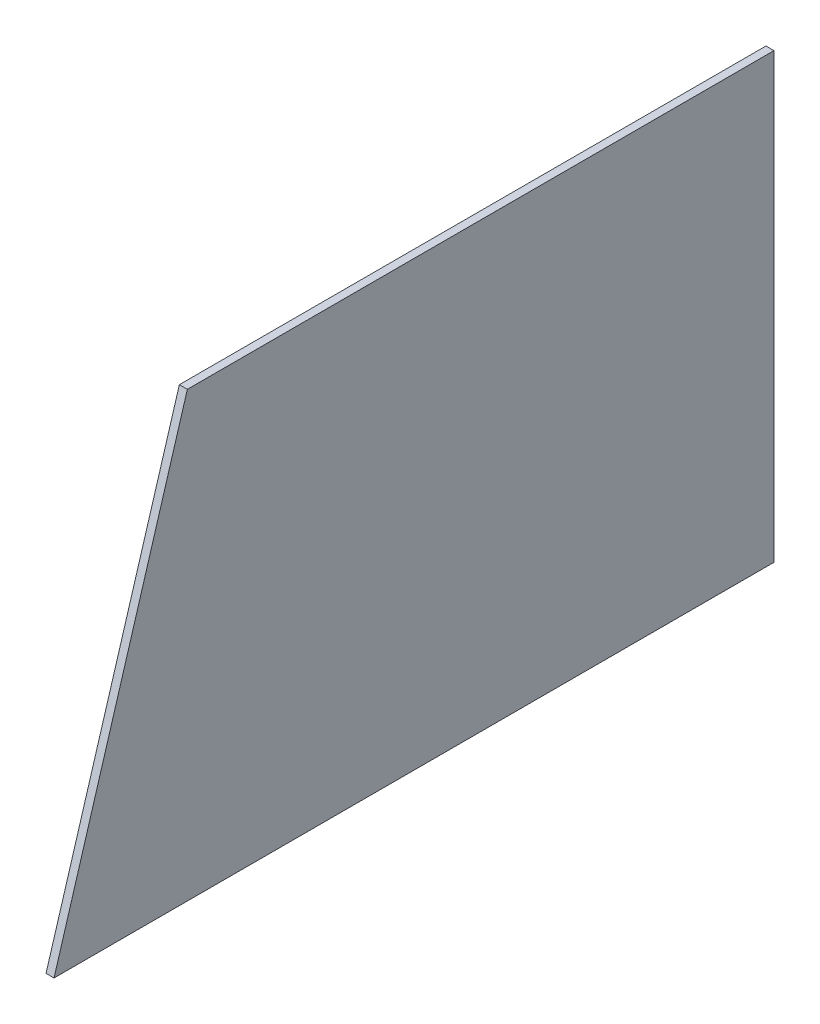
ISO-10303-21;
HEADER;
FILE_DESCRIPTION(('STEP AP214'),'2;1');
FILE_NAME('part.step','',(''),(''),'','','');
FILE_SCHEMA(('AUTOMOTIVE_DESIGN { 1 0 10303 214 1 1 1 1 }'));
ENDSEC;
DATA;
#1=APPLICATION_CONTEXT('core data for automotive mechanical design processes');
#2=APPLICATION_PROTOCOL_DEFINITION('international standard','automotive_design',2000,#1);
#3=PRODUCT_CONTEXT('',#1,'mechanical');
#4=PRODUCT('Part','Part','',(#3));
#5=PRODUCT_RELATED_PRODUCT_CATEGORY('part','',(#4));
#6=PRODUCT_DEFINITION_FORMATION('','',#4);
#7=PRODUCT_DEFINITION_CONTEXT('part definition',#1,'design');
#8=PRODUCT_DEFINITION('design','',#6,#7);
#9=PRODUCT_DEFINITION_SHAPE('','',#8);
#10=(LENGTH_UNIT() NAMED_UNIT(*) SI_UNIT(.MILLI.,.METRE.));
#11=(NAMED_UNIT(*) PLANE_ANGLE_UNIT() SI_UNIT($,.RADIAN.));
#12=(NAMED_UNIT(*) SI_UNIT($,.STERADIAN.) SOLID_ANGLE_UNIT());
#13=UNCERTAINTY_MEASURE_WITH_UNIT(LENGTH_MEASURE(1.E-05),#10,'distance_accuracy_value','');
#14=(GEOMETRIC_REPRESENTATION_CONTEXT(3) GLOBAL_UNCERTAINTY_ASSIGNED_CONTEXT((#13)) GLOBAL_UNIT_ASSIGNED_CONTEXT((#10,
#11,#12)) REPRESENTATION_CONTEXT('',''));
#15=CARTESIAN_POINT('',(0.,0.,0.));
#16=DIRECTION('',(0.,0.,1.));
#17=DIRECTION('',(1.,0.,0.));
#18=AXIS2_PLACEMENT_3D('',#15,#16,#17);
#19=CARTESIAN_POINT('',(3.,-98.7355891387449,270.));
#20=DIRECTION('',(0.,-0.288075600957839,-0.957607669211551));
#21=DIRECTION('',(0.,0.957607669211551,-0.288075600957839));
#22=AXIS2_PLACEMENT_3D('',#19,#20,#21);
#23=PLANE('',#22);
#24=DIRECTION('',(0.,-0.957607669211551,0.288075600957839));
#25=VECTOR('',#24,1.);
#26=CARTESIAN_POINT('',(0.,-98.7355891387449,270.));
#27=LINE('',#26,#25);
#28=CARTESIAN_POINT('',(0.,67.4721122472017,220.));
#29=VERTEX_POINT('',#28);
#30=CARTESIAN_POINT('',(0.,-98.7355891387449,270.));
#31=VERTEX_POINT('',#30);
#32=EDGE_CURVE('E96',#29,#31,#27,.T.);
#33=ORIENTED_EDGE('',*,*,#32,.T.);
#34=DIRECTION('',(-1.,0.,0.));
#35=VECTOR('',#34,1.);
#36=CARTESIAN_POINT('',(3.,-98.7355891387449,270.));
#37=LINE('',#36,#35);
#38=CARTESIAN_POINT('',(3.,-98.7355891387449,270.));
#39=VERTEX_POINT('',#38);
#40=EDGE_CURVE('E11',#39,#31,#37,.T.);
#41=ORIENTED_EDGE('',*,*,#40,.F.);
#42=DIRECTION('',(0.,-0.957607669211551,0.288075600957839));
#43=VECTOR('',#42,1.);
#44=CARTESIAN_POINT('',(3.,-98.7355891387449,270.));
#45=LINE('',#44,#43);
#46=CARTESIAN_POINT('',(3.,67.4721122472017,220.));
#47=VERTEX_POINT('',#46);
#48=EDGE_CURVE('E84',#47,#39,#45,.T.);
#49=ORIENTED_EDGE('',*,*,#48,.F.);
#50=DIRECTION('',(-1.,0.,0.));
#51=VECTOR('',#50,1.);
#52=CARTESIAN_POINT('',(3.,67.4721122472017,220.));
#53=LINE('',#52,#51);
#54=EDGE_CURVE('E92',#47,#29,#53,.T.);
#55=ORIENTED_EDGE('',*,*,#54,.T.);
#56=EDGE_LOOP('',(#33,#41,#49,#55));
#57=FACE_BOUND('',#56,.T.);
#58=ADVANCED_FACE('F33',(#57),#23,.F.);
#59=CARTESIAN_POINT('',(3.,-98.735589138745,0.));
#60=DIRECTION('',(0.,1.,0.));
#61=DIRECTION('',(0.,0.,1.));
#62=AXIS2_PLACEMENT_3D('',#59,#60,#61);
#63=PLANE('',#62);
#64=DIRECTION('',(0.,0.,-1.));
#65=VECTOR('',#64,1.);
#66=CARTESIAN_POINT('',(0.,-98.735589138745,0.));
#67=LINE('',#66,#65);
#68=CARTESIAN_POINT('',(0.,-98.735589138745,0.));
#69=VERTEX_POINT('',#68);
#70=EDGE_CURVE('E88',#31,#69,#67,.T.);
#71=ORIENTED_EDGE('',*,*,#70,.T.);
#72=DIRECTION('',(-1.,0.,0.));
#73=VECTOR('',#72,1.);
#74=CARTESIAN_POINT('',(3.,-98.735589138745,0.));
#75=LINE('',#74,#73);
#76=CARTESIAN_POINT('',(3.,-98.735589138745,0.));
#77=VERTEX_POINT('',#76);
#78=EDGE_CURVE('E41',#77,#69,#75,.T.);
#79=ORIENTED_EDGE('',*,*,#78,.F.);
#80=DIRECTION('',(0.,0.,-1.));
#81=VECTOR('',#80,1.);
#82=CARTESIAN_POINT('',(3.,-98.735589138745,0.));
#83=LINE('',#82,#81);
#84=EDGE_CURVE('E79',#39,#77,#83,.T.);
#85=ORIENTED_EDGE('',*,*,#84,.F.);
#86=ORIENTED_EDGE('',*,*,#40,.T.);
#87=EDGE_LOOP('',(#71,#79,#85,#86));
#88=FACE_BOUND('',#87,.T.);
#89=ADVANCED_FACE('F87',(#88),#63,.F.);
#90=CARTESIAN_POINT('',(3.,67.4721122472017,0.));
#91=DIRECTION('',(0.,0.,1.));
#92=DIRECTION('',(1.,0.,0.));
#93=AXIS2_PLACEMENT_3D('',#90,#91,#92);
#94=PLANE('',#93);
#95=DIRECTION('',(0.,1.,0.));
#96=VECTOR('',#95,1.);
#97=CARTESIAN_POINT('',(0.,67.4721122472017,0.));
#98=LINE('',#97,#96);
#99=CARTESIAN_POINT('',(0.,67.4721122472017,0.));
#100=VERTEX_POINT('',#99);
#101=EDGE_CURVE('E66',#69,#100,#98,.T.);
#102=ORIENTED_EDGE('',*,*,#101,.T.);
#103=DIRECTION('',(-1.,0.,0.));
#104=VECTOR('',#103,1.);
#105=CARTESIAN_POINT('',(3.,67.4721122472017,0.));
#106=LINE('',#105,#104);
#107=CARTESIAN_POINT('',(3.,67.4721122472017,0.));
#108=VERTEX_POINT('',#107);
#109=EDGE_CURVE('E89',#108,#100,#106,.T.);
#110=ORIENTED_EDGE('',*,*,#109,.F.);
#111=DIRECTION('',(0.,1.,0.));
#112=VECTOR('',#111,1.);
#113=CARTESIAN_POINT('',(3.,67.4721122472017,0.));
#114=LINE('',#113,#112);
#115=EDGE_CURVE('E82',#77,#108,#114,.T.);
#116=ORIENTED_EDGE('',*,*,#115,.F.);
#117=ORIENTED_EDGE('',*,*,#78,.T.);
#118=EDGE_LOOP('',(#102,#110,#116,#117));
#119=FACE_BOUND('',#118,.T.);
#120=ADVANCED_FACE('F90',(#119),#94,.F.);
#121=CARTESIAN_POINT('',(3.,67.4721122472017,220.));
#122=DIRECTION('',(0.,-1.,0.));
#123=DIRECTION('',(0.,0.,-1.));
#124=AXIS2_PLACEMENT_3D('',#121,#122,#123);
#125=PLANE('',#124);
#126=DIRECTION('',(0.,0.,1.));
#127=VECTOR('',#126,1.);
#128=CARTESIAN_POINT('',(0.,67.4721122472017,220.));
#129=LINE('',#128,#127);
#130=EDGE_CURVE('E72',#100,#29,#129,.T.);
#131=ORIENTED_EDGE('',*,*,#130,.T.);
#132=ORIENTED_EDGE('',*,*,#54,.F.);
#133=DIRECTION('',(0.,0.,1.));
#134=VECTOR('',#133,1.);
#135=CARTESIAN_POINT('',(3.,67.4721122472017,220.));
#136=LINE('',#135,#134);
#137=EDGE_CURVE('E49',#108,#47,#136,.T.);
#138=ORIENTED_EDGE('',*,*,#137,.F.);
#139=ORIENTED_EDGE('',*,*,#109,.T.);
#140=EDGE_LOOP('',(#131,#132,#138,#139));
#141=FACE_BOUND('',#140,.T.);
#142=ADVANCED_FACE('F103',(#141),#125,.F.);
#143=CARTESIAN_POINT('',(3.,0.,0.));
#144=DIRECTION('',(-1.,0.,0.));
#145=DIRECTION('',(0.,0.,1.));
#146=AXIS2_PLACEMENT_3D('',#143,#144,#145);
#147=PLANE('',#146);
#148=ORIENTED_EDGE('',*,*,#48,.T.);
#149=ORIENTED_EDGE('',*,*,#84,.T.);
#150=ORIENTED_EDGE('',*,*,#115,.T.);
#151=ORIENTED_EDGE('',*,*,#137,.T.);
#152=EDGE_LOOP('',(#148,#149,#150,#151));
#153=FACE_BOUND('',#152,.T.);
#154=ADVANCED_FACE('F80',(#153),#147,.F.);
#155=CARTESIAN_POINT('',(0.,0.,0.));
#156=DIRECTION('',(-1.,0.,0.));
#157=DIRECTION('',(0.,0.,1.));
#158=AXIS2_PLACEMENT_3D('',#155,#156,#157);
#159=PLANE('',#158);
#160=ORIENTED_EDGE('',*,*,#32,.F.);
#161=ORIENTED_EDGE('',*,*,#130,.F.);
#162=ORIENTED_EDGE('',*,*,#101,.F.);
#163=ORIENTED_EDGE('',*,*,#70,.F.);
#164=EDGE_LOOP('',(#160,#161,#162,#163));
#165=FACE_BOUND('',#164,.T.);
#166=ADVANCED_FACE('F106',(#165),#159,.T.);
#167=CLOSED_SHELL('',(#58,#89,#120,#142,#154,#166));
#168=MANIFOLD_SOLID_BREP('B2',#167);
#169=ADVANCED_BREP_SHAPE_REPRESENTATION('',(#18,#168),#14);
#170=SHAPE_DEFINITION_REPRESENTATION(#9,#169);
ENDSEC;
END-ISO-10303-21;
